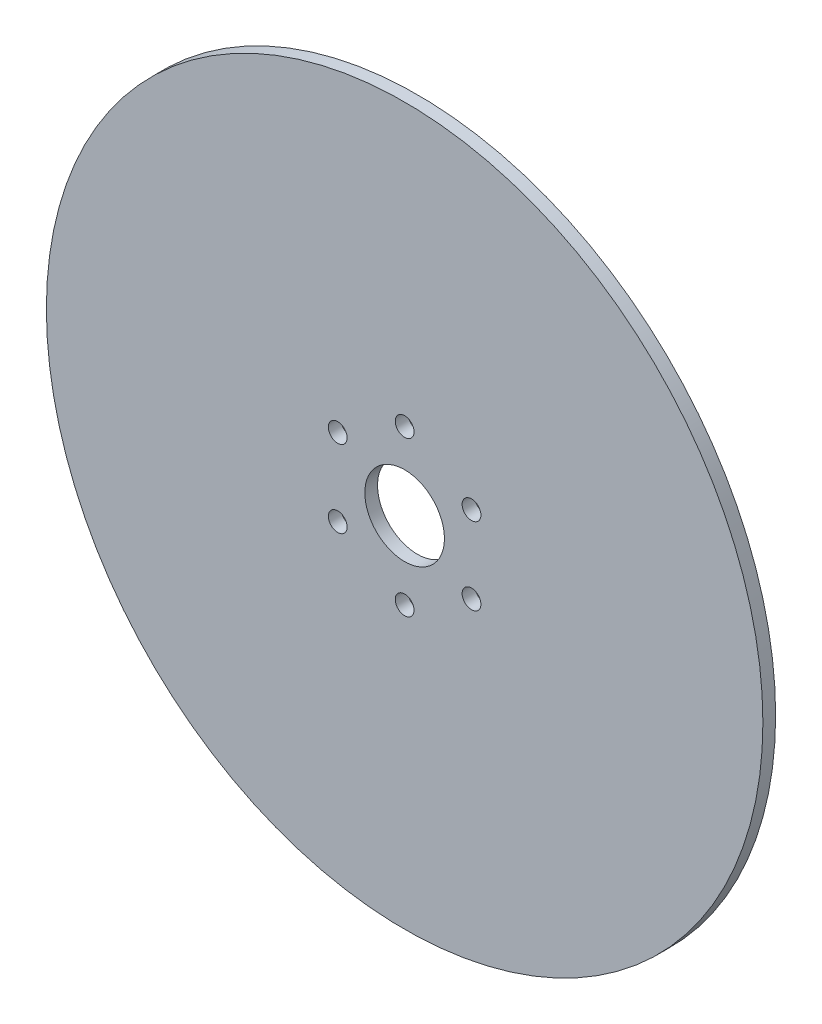
ISO-10303-21;
HEADER;
FILE_DESCRIPTION(('STEP AP214'),'2;1');
FILE_NAME('part.step','',(''),(''),'','','');
FILE_SCHEMA(('AUTOMOTIVE_DESIGN { 1 0 10303 214 1 1 1 1 }'));
ENDSEC;
DATA;
#1=APPLICATION_CONTEXT('core data for automotive mechanical design processes');
#2=APPLICATION_PROTOCOL_DEFINITION('international standard','automotive_design',2000,#1);
#3=PRODUCT_CONTEXT('',#1,'mechanical');
#4=PRODUCT('Part','Part','',(#3));
#5=PRODUCT_RELATED_PRODUCT_CATEGORY('part','',(#4));
#6=PRODUCT_DEFINITION_FORMATION('','',#4);
#7=PRODUCT_DEFINITION_CONTEXT('part definition',#1,'design');
#8=PRODUCT_DEFINITION('design','',#6,#7);
#9=PRODUCT_DEFINITION_SHAPE('','',#8);
#10=(LENGTH_UNIT() NAMED_UNIT(*) SI_UNIT(.MILLI.,.METRE.));
#11=(NAMED_UNIT(*) PLANE_ANGLE_UNIT() SI_UNIT($,.RADIAN.));
#12=(NAMED_UNIT(*) SI_UNIT($,.STERADIAN.) SOLID_ANGLE_UNIT());
#13=UNCERTAINTY_MEASURE_WITH_UNIT(LENGTH_MEASURE(1.E-05),#10,'distance_accuracy_value','');
#14=(GEOMETRIC_REPRESENTATION_CONTEXT(3) GLOBAL_UNCERTAINTY_ASSIGNED_CONTEXT((#13)) GLOBAL_UNIT_ASSIGNED_CONTEXT((#10,
#11,#12)) REPRESENTATION_CONTEXT('',''));
#15=CARTESIAN_POINT('',(0.,0.,0.));
#16=DIRECTION('',(0.,0.,1.));
#17=DIRECTION('',(1.,0.,0.));
#18=AXIS2_PLACEMENT_3D('',#15,#16,#17);
#19=CARTESIAN_POINT('',(0.,0.,4.064));
#20=DIRECTION('',(0.,0.,-1.));
#21=DIRECTION('',(-1.,0.,0.));
#22=AXIS2_PLACEMENT_3D('',#19,#20,#21);
#23=CYLINDRICAL_SURFACE('',#22,114.3);
#24=CARTESIAN_POINT('',(0.,0.,4.064));
#25=DIRECTION('',(0.,0.,1.));
#26=DIRECTION('',(1.,0.,0.));
#27=AXIS2_PLACEMENT_3D('',#24,#25,#26);
#28=CIRCLE('',#27,114.3);
#29=CARTESIAN_POINT('',(114.3,0.,4.064));
#30=VERTEX_POINT('',#29);
#31=EDGE_CURVE('E10',#30,#30,#28,.T.);
#32=ORIENTED_EDGE('',*,*,#31,.F.);
#33=EDGE_LOOP('',(#32));
#34=FACE_BOUND('',#33,.T.);
#35=CARTESIAN_POINT('',(0.,0.,0.));
#36=DIRECTION('',(0.,0.,1.));
#37=DIRECTION('',(1.,0.,0.));
#38=AXIS2_PLACEMENT_3D('',#35,#36,#37);
#39=CIRCLE('',#38,114.3);
#40=CARTESIAN_POINT('',(114.3,0.,0.));
#41=VERTEX_POINT('',#40);
#42=EDGE_CURVE('E49',#41,#41,#39,.T.);
#43=ORIENTED_EDGE('',*,*,#42,.T.);
#44=EDGE_LOOP('',(#43));
#45=FACE_BOUND('',#44,.T.);
#46=ADVANCED_FACE('F41',(#34,#45),#23,.T.);
#47=CARTESIAN_POINT('',(0.,0.,4.064));
#48=DIRECTION('',(0.,0.,1.));
#49=DIRECTION('',(1.,0.,0.));
#50=AXIS2_PLACEMENT_3D('',#47,#48,#49);
#51=PLANE('',#50);
#52=CARTESIAN_POINT('',(0.,-24.638,4.064));
#53=DIRECTION('',(0.,0.,1.));
#54=DIRECTION('',(1.,0.,0.));
#55=AXIS2_PLACEMENT_3D('',#52,#53,#54);
#56=CIRCLE('',#55,2.9972);
#57=CARTESIAN_POINT('',(2.9972,-24.638,4.064));
#58=VERTEX_POINT('',#57);
#59=EDGE_CURVE('E69',#58,#58,#56,.T.);
#60=ORIENTED_EDGE('',*,*,#59,.F.);
#61=EDGE_LOOP('',(#60));
#62=FACE_BOUND('',#61,.T.);
#63=CARTESIAN_POINT('',(-21.337133898441,-12.319,4.064));
#64=DIRECTION('',(0.,0.,1.));
#65=DIRECTION('',(1.,0.,0.));
#66=AXIS2_PLACEMENT_3D('',#63,#64,#65);
#67=CIRCLE('',#66,2.9972);
#68=CARTESIAN_POINT('',(-18.339933898441,-12.319,4.064));
#69=VERTEX_POINT('',#68);
#70=EDGE_CURVE('E158',#69,#69,#67,.T.);
#71=ORIENTED_EDGE('',*,*,#70,.F.);
#72=EDGE_LOOP('',(#71));
#73=FACE_BOUND('',#72,.T.);
#74=CARTESIAN_POINT('',(-21.3371338984409,12.3190000000001,4.064));
#75=DIRECTION('',(0.,0.,1.));
#76=DIRECTION('',(1.,0.,0.));
#77=AXIS2_PLACEMENT_3D('',#74,#75,#76);
#78=CIRCLE('',#77,2.9972);
#79=CARTESIAN_POINT('',(-18.3399338984409,12.3190000000001,4.064));
#80=VERTEX_POINT('',#79);
#81=EDGE_CURVE('E162',#80,#80,#78,.T.);
#82=ORIENTED_EDGE('',*,*,#81,.F.);
#83=EDGE_LOOP('',(#82));
#84=FACE_BOUND('',#83,.T.);
#85=CARTESIAN_POINT('',(1.70584251104012E-13,24.638,4.064));
#86=DIRECTION('',(0.,0.,1.));
#87=DIRECTION('',(1.,0.,0.));
#88=AXIS2_PLACEMENT_3D('',#85,#86,#87);
#89=CIRCLE('',#88,2.9972);
#90=CARTESIAN_POINT('',(2.99720000000017,24.638,4.064));
#91=VERTEX_POINT('',#90);
#92=EDGE_CURVE('E155',#91,#91,#89,.T.);
#93=ORIENTED_EDGE('',*,*,#92,.F.);
#94=EDGE_LOOP('',(#93));
#95=FACE_BOUND('',#94,.T.);
#96=CARTESIAN_POINT('',(21.3371338984411,12.3189999999998,4.064));
#97=DIRECTION('',(0.,0.,1.));
#98=DIRECTION('',(1.,0.,0.));
#99=AXIS2_PLACEMENT_3D('',#96,#97,#98);
#100=CIRCLE('',#99,2.9972);
#101=CARTESIAN_POINT('',(24.3343338984411,12.3189999999998,4.064));
#102=VERTEX_POINT('',#101);
#103=EDGE_CURVE('E149',#102,#102,#100,.T.);
#104=ORIENTED_EDGE('',*,*,#103,.F.);
#105=EDGE_LOOP('',(#104));
#106=FACE_BOUND('',#105,.T.);
#107=CARTESIAN_POINT('',(21.3371338984409,-12.3190000000002,4.064));
#108=DIRECTION('',(0.,0.,1.));
#109=DIRECTION('',(1.,0.,0.));
#110=AXIS2_PLACEMENT_3D('',#107,#108,#109);
#111=CIRCLE('',#110,2.9972);
#112=CARTESIAN_POINT('',(24.3343338984409,-12.3190000000002,4.064));
#113=VERTEX_POINT('',#112);
#114=EDGE_CURVE('E141',#113,#113,#111,.T.);
#115=ORIENTED_EDGE('',*,*,#114,.F.);
#116=EDGE_LOOP('',(#115));
#117=FACE_BOUND('',#116,.T.);
#118=CARTESIAN_POINT('',(0.,0.,4.064));
#119=DIRECTION('',(0.,0.,1.));
#120=DIRECTION('',(1.,0.,0.));
#121=AXIS2_PLACEMENT_3D('',#118,#119,#120);
#122=CIRCLE('',#121,12.7);
#123=CARTESIAN_POINT('',(12.7,0.,4.064));
#124=VERTEX_POINT('',#123);
#125=EDGE_CURVE('E55',#124,#124,#122,.T.);
#126=ORIENTED_EDGE('',*,*,#125,.F.);
#127=EDGE_LOOP('',(#126));
#128=FACE_BOUND('',#127,.T.);
#129=ORIENTED_EDGE('',*,*,#31,.T.);
#130=EDGE_LOOP('',(#129));
#131=FACE_BOUND('',#130,.T.);
#132=ADVANCED_FACE('F104',(#62,#73,#84,#95,#106,#117,#128,#131),#51,.T.);
#133=CARTESIAN_POINT('',(0.,0.,0.));
#134=DIRECTION('',(0.,0.,1.));
#135=DIRECTION('',(1.,0.,0.));
#136=AXIS2_PLACEMENT_3D('',#133,#134,#135);
#137=PLANE('',#136);
#138=CARTESIAN_POINT('',(0.,-24.638,0.));
#139=DIRECTION('',(0.,0.,1.));
#140=DIRECTION('',(1.,0.,0.));
#141=AXIS2_PLACEMENT_3D('',#138,#139,#140);
#142=CIRCLE('',#141,2.9972);
#143=CARTESIAN_POINT('',(2.9972,-24.638,0.));
#144=VERTEX_POINT('',#143);
#145=EDGE_CURVE('E44',#144,#144,#142,.T.);
#146=ORIENTED_EDGE('',*,*,#145,.T.);
#147=EDGE_LOOP('',(#146));
#148=FACE_BOUND('',#147,.T.);
#149=CARTESIAN_POINT('',(-21.337133898441,-12.319,0.));
#150=DIRECTION('',(0.,0.,1.));
#151=DIRECTION('',(1.,0.,0.));
#152=AXIS2_PLACEMENT_3D('',#149,#150,#151);
#153=CIRCLE('',#152,2.9972);
#154=CARTESIAN_POINT('',(-18.339933898441,-12.319,0.));
#155=VERTEX_POINT('',#154);
#156=EDGE_CURVE('E80',#155,#155,#153,.T.);
#157=ORIENTED_EDGE('',*,*,#156,.T.);
#158=EDGE_LOOP('',(#157));
#159=FACE_BOUND('',#158,.T.);
#160=CARTESIAN_POINT('',(-21.3371338984409,12.3190000000001,0.));
#161=DIRECTION('',(0.,0.,1.));
#162=DIRECTION('',(1.,0.,0.));
#163=AXIS2_PLACEMENT_3D('',#160,#161,#162);
#164=CIRCLE('',#163,2.9972);
#165=CARTESIAN_POINT('',(-18.3399338984409,12.3190000000001,0.));
#166=VERTEX_POINT('',#165);
#167=EDGE_CURVE('E77',#166,#166,#164,.T.);
#168=ORIENTED_EDGE('',*,*,#167,.T.);
#169=EDGE_LOOP('',(#168));
#170=FACE_BOUND('',#169,.T.);
#171=CARTESIAN_POINT('',(1.70584251104012E-13,24.638,0.));
#172=DIRECTION('',(0.,0.,1.));
#173=DIRECTION('',(1.,0.,0.));
#174=AXIS2_PLACEMENT_3D('',#171,#172,#173);
#175=CIRCLE('',#174,2.9972);
#176=CARTESIAN_POINT('',(2.99720000000017,24.638,0.));
#177=VERTEX_POINT('',#176);
#178=EDGE_CURVE('E73',#177,#177,#175,.T.);
#179=ORIENTED_EDGE('',*,*,#178,.T.);
#180=EDGE_LOOP('',(#179));
#181=FACE_BOUND('',#180,.T.);
#182=CARTESIAN_POINT('',(21.3371338984411,12.3189999999998,0.));
#183=DIRECTION('',(0.,0.,1.));
#184=DIRECTION('',(1.,0.,0.));
#185=AXIS2_PLACEMENT_3D('',#182,#183,#184);
#186=CIRCLE('',#185,2.9972);
#187=CARTESIAN_POINT('',(24.3343338984411,12.3189999999998,0.));
#188=VERTEX_POINT('',#187);
#189=EDGE_CURVE('E68',#188,#188,#186,.T.);
#190=ORIENTED_EDGE('',*,*,#189,.T.);
#191=EDGE_LOOP('',(#190));
#192=FACE_BOUND('',#191,.T.);
#193=CARTESIAN_POINT('',(21.3371338984409,-12.3190000000002,0.));
#194=DIRECTION('',(0.,0.,1.));
#195=DIRECTION('',(1.,0.,0.));
#196=AXIS2_PLACEMENT_3D('',#193,#194,#195);
#197=CIRCLE('',#196,2.9972);
#198=CARTESIAN_POINT('',(24.3343338984409,-12.3190000000002,0.));
#199=VERTEX_POINT('',#198);
#200=EDGE_CURVE('E64',#199,#199,#197,.T.);
#201=ORIENTED_EDGE('',*,*,#200,.T.);
#202=EDGE_LOOP('',(#201));
#203=FACE_BOUND('',#202,.T.);
#204=CARTESIAN_POINT('',(0.,0.,0.));
#205=DIRECTION('',(0.,0.,1.));
#206=DIRECTION('',(1.,0.,0.));
#207=AXIS2_PLACEMENT_3D('',#204,#205,#206);
#208=CIRCLE('',#207,12.7);
#209=CARTESIAN_POINT('',(12.7,0.,0.));
#210=VERTEX_POINT('',#209);
#211=EDGE_CURVE('E60',#210,#210,#208,.T.);
#212=ORIENTED_EDGE('',*,*,#211,.T.);
#213=EDGE_LOOP('',(#212));
#214=FACE_BOUND('',#213,.T.);
#215=ORIENTED_EDGE('',*,*,#42,.F.);
#216=EDGE_LOOP('',(#215));
#217=FACE_BOUND('',#216,.T.);
#218=ADVANCED_FACE('F89',(#148,#159,#170,#181,#192,#203,#214,#217),#137,.F.);
#219=CARTESIAN_POINT('',(0.,0.,-97.536));
#220=DIRECTION('',(0.,0.,1.));
#221=DIRECTION('',(1.,0.,0.));
#222=AXIS2_PLACEMENT_3D('',#219,#220,#221);
#223=CYLINDRICAL_SURFACE('',#222,12.7);
#224=ORIENTED_EDGE('',*,*,#125,.T.);
#225=EDGE_LOOP('',(#224));
#226=FACE_BOUND('',#225,.T.);
#227=ORIENTED_EDGE('',*,*,#211,.F.);
#228=EDGE_LOOP('',(#227));
#229=FACE_BOUND('',#228,.T.);
#230=ADVANCED_FACE('F115',(#226,#229),#223,.F.);
#231=CARTESIAN_POINT('',(21.3371338984409,-12.3190000000002,-66.548));
#232=DIRECTION('',(0.,0.,1.));
#233=DIRECTION('',(1.,0.,0.));
#234=AXIS2_PLACEMENT_3D('',#231,#232,#233);
#235=CYLINDRICAL_SURFACE('',#234,2.9972);
#236=ORIENTED_EDGE('',*,*,#114,.T.);
#237=EDGE_LOOP('',(#236));
#238=FACE_BOUND('',#237,.T.);
#239=ORIENTED_EDGE('',*,*,#200,.F.);
#240=EDGE_LOOP('',(#239));
#241=FACE_BOUND('',#240,.T.);
#242=ADVANCED_FACE('F119',(#238,#241),#235,.F.);
#243=CARTESIAN_POINT('',(21.3371338984411,12.3189999999998,-66.548));
#244=DIRECTION('',(0.,0.,1.));
#245=DIRECTION('',(1.,0.,0.));
#246=AXIS2_PLACEMENT_3D('',#243,#244,#245);
#247=CYLINDRICAL_SURFACE('',#246,2.9972);
#248=ORIENTED_EDGE('',*,*,#103,.T.);
#249=EDGE_LOOP('',(#248));
#250=FACE_BOUND('',#249,.T.);
#251=ORIENTED_EDGE('',*,*,#189,.F.);
#252=EDGE_LOOP('',(#251));
#253=FACE_BOUND('',#252,.T.);
#254=ADVANCED_FACE('F129',(#250,#253),#247,.F.);
#255=CARTESIAN_POINT('',(1.70584251104012E-13,24.638,-66.548));
#256=DIRECTION('',(0.,0.,1.));
#257=DIRECTION('',(1.,0.,0.));
#258=AXIS2_PLACEMENT_3D('',#255,#256,#257);
#259=CYLINDRICAL_SURFACE('',#258,2.9972);
#260=ORIENTED_EDGE('',*,*,#92,.T.);
#261=EDGE_LOOP('',(#260));
#262=FACE_BOUND('',#261,.T.);
#263=ORIENTED_EDGE('',*,*,#178,.F.);
#264=EDGE_LOOP('',(#263));
#265=FACE_BOUND('',#264,.T.);
#266=ADVANCED_FACE('F125',(#262,#265),#259,.F.);
#267=CARTESIAN_POINT('',(-21.3371338984409,12.3190000000001,-66.548));
#268=DIRECTION('',(0.,0.,1.));
#269=DIRECTION('',(1.,0.,0.));
#270=AXIS2_PLACEMENT_3D('',#267,#268,#269);
#271=CYLINDRICAL_SURFACE('',#270,2.9972);
#272=ORIENTED_EDGE('',*,*,#81,.T.);
#273=EDGE_LOOP('',(#272));
#274=FACE_BOUND('',#273,.T.);
#275=ORIENTED_EDGE('',*,*,#167,.F.);
#276=EDGE_LOOP('',(#275));
#277=FACE_BOUND('',#276,.T.);
#278=ADVANCED_FACE('F99',(#274,#277),#271,.F.);
#279=CARTESIAN_POINT('',(-21.337133898441,-12.319,-66.548));
#280=DIRECTION('',(0.,0.,1.));
#281=DIRECTION('',(1.,0.,0.));
#282=AXIS2_PLACEMENT_3D('',#279,#280,#281);
#283=CYLINDRICAL_SURFACE('',#282,2.9972);
#284=ORIENTED_EDGE('',*,*,#70,.T.);
#285=EDGE_LOOP('',(#284));
#286=FACE_BOUND('',#285,.T.);
#287=ORIENTED_EDGE('',*,*,#156,.F.);
#288=EDGE_LOOP('',(#287));
#289=FACE_BOUND('',#288,.T.);
#290=ADVANCED_FACE('F93',(#286,#289),#283,.F.);
#291=CARTESIAN_POINT('',(0.,-24.638,-66.548));
#292=DIRECTION('',(0.,0.,1.));
#293=DIRECTION('',(1.,0.,0.));
#294=AXIS2_PLACEMENT_3D('',#291,#292,#293);
#295=CYLINDRICAL_SURFACE('',#294,2.9972);
#296=ORIENTED_EDGE('',*,*,#59,.T.);
#297=EDGE_LOOP('',(#296));
#298=FACE_BOUND('',#297,.T.);
#299=ORIENTED_EDGE('',*,*,#145,.F.);
#300=EDGE_LOOP('',(#299));
#301=FACE_BOUND('',#300,.T.);
#302=ADVANCED_FACE('F91',(#298,#301),#295,.F.);
#303=CLOSED_SHELL('',(#46,#132,#218,#230,#242,#254,#266,#278,#290,#302));
#304=MANIFOLD_SOLID_BREP('B2',#303);
#305=ADVANCED_BREP_SHAPE_REPRESENTATION('',(#18,#304),#14);
#306=SHAPE_DEFINITION_REPRESENTATION(#9,#305);
ENDSEC;
END-ISO-10303-21;
